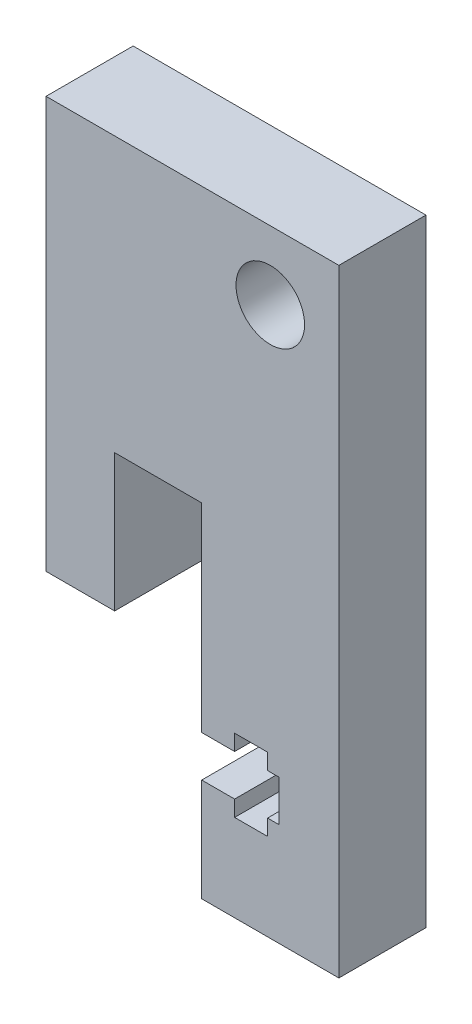
ISO-10303-21;
HEADER;
FILE_DESCRIPTION(('STEP AP214'),'2;1');
FILE_NAME('part.step','',(''),(''),'','','');
FILE_SCHEMA(('AUTOMOTIVE_DESIGN { 1 0 10303 214 1 1 1 1 }'));
ENDSEC;
DATA;
#1=APPLICATION_CONTEXT('core data for automotive mechanical design processes');
#2=APPLICATION_PROTOCOL_DEFINITION('international standard','automotive_design',2000,#1);
#3=PRODUCT_CONTEXT('',#1,'mechanical');
#4=PRODUCT('Part','Part','',(#3));
#5=PRODUCT_RELATED_PRODUCT_CATEGORY('part','',(#4));
#6=PRODUCT_DEFINITION_FORMATION('','',#4);
#7=PRODUCT_DEFINITION_CONTEXT('part definition',#1,'design');
#8=PRODUCT_DEFINITION('design','',#6,#7);
#9=PRODUCT_DEFINITION_SHAPE('','',#8);
#10=(LENGTH_UNIT() NAMED_UNIT(*) SI_UNIT(.MILLI.,.METRE.));
#11=(NAMED_UNIT(*) PLANE_ANGLE_UNIT() SI_UNIT($,.RADIAN.));
#12=(NAMED_UNIT(*) SI_UNIT($,.STERADIAN.) SOLID_ANGLE_UNIT());
#13=UNCERTAINTY_MEASURE_WITH_UNIT(LENGTH_MEASURE(1.E-05),#10,'distance_accuracy_value','');
#14=(GEOMETRIC_REPRESENTATION_CONTEXT(3) GLOBAL_UNCERTAINTY_ASSIGNED_CONTEXT((#13)) GLOBAL_UNIT_ASSIGNED_CONTEXT((#10,
#11,#12)) REPRESENTATION_CONTEXT('',''));
#15=CARTESIAN_POINT('',(0.,0.,0.));
#16=DIRECTION('',(0.,0.,1.));
#17=DIRECTION('',(1.,0.,0.));
#18=AXIS2_PLACEMENT_3D('',#15,#16,#17);
#19=CARTESIAN_POINT('',(0.940553214138691,0.,6.35));
#20=DIRECTION('',(-1.,0.,0.));
#21=DIRECTION('',(0.,-1.,0.));
#22=AXIS2_PLACEMENT_3D('',#19,#20,#21);
#23=PLANE('',#22);
#24=DIRECTION('',(0.,1.,0.));
#25=VECTOR('',#24,1.);
#26=CARTESIAN_POINT('',(0.940553214138691,0.,0.));
#27=LINE('',#26,#25);
#28=CARTESIAN_POINT('',(0.940553214138687,-4.4432697036601,0.));
#29=VERTEX_POINT('',#28);
#30=CARTESIAN_POINT('',(0.940553214138688,-3.2832697036601,0.));
#31=VERTEX_POINT('',#30);
#32=EDGE_CURVE('E213',#29,#31,#27,.T.);
#33=ORIENTED_EDGE('',*,*,#32,.T.);
#34=DIRECTION('',(0.,0.,-1.));
#35=VECTOR('',#34,1.);
#36=CARTESIAN_POINT('',(0.940553214138688,-3.2832697036601,6.35));
#37=LINE('',#36,#35);
#38=CARTESIAN_POINT('',(0.940553214138688,-3.2832697036601,6.35));
#39=VERTEX_POINT('',#38);
#40=EDGE_CURVE('E11',#39,#31,#37,.T.);
#41=ORIENTED_EDGE('',*,*,#40,.F.);
#42=DIRECTION('',(0.,1.,0.));
#43=VECTOR('',#42,1.);
#44=CARTESIAN_POINT('',(0.940553214138691,0.,6.35));
#45=LINE('',#44,#43);
#46=CARTESIAN_POINT('',(0.940553214138687,-4.4432697036601,6.35));
#47=VERTEX_POINT('',#46);
#48=EDGE_CURVE('E319',#47,#39,#45,.T.);
#49=ORIENTED_EDGE('',*,*,#48,.F.);
#50=DIRECTION('',(0.,0.,-1.));
#51=VECTOR('',#50,1.);
#52=CARTESIAN_POINT('',(0.940553214138687,-4.4432697036601,6.35));
#53=LINE('',#52,#51);
#54=EDGE_CURVE('E206',#47,#29,#53,.T.);
#55=ORIENTED_EDGE('',*,*,#54,.T.);
#56=EDGE_LOOP('',(#33,#41,#49,#55));
#57=FACE_BOUND('',#56,.T.);
#58=ADVANCED_FACE('F41',(#57),#23,.F.);
#59=CARTESIAN_POINT('',(0.,-3.2832697036601,6.35));
#60=DIRECTION('',(0.,-1.,0.));
#61=DIRECTION('',(0.,0.,-1.));
#62=AXIS2_PLACEMENT_3D('',#59,#60,#61);
#63=PLANE('',#62);
#64=DIRECTION('',(-1.,0.,0.));
#65=VECTOR('',#64,1.);
#66=CARTESIAN_POINT('',(0.,-3.2832697036601,0.));
#67=LINE('',#66,#65);
#68=CARTESIAN_POINT('',(-1.45944678586131,-3.2832697036601,0.));
#69=VERTEX_POINT('',#68);
#70=EDGE_CURVE('E216',#31,#69,#67,.T.);
#71=ORIENTED_EDGE('',*,*,#70,.T.);
#72=DIRECTION('',(0.,0.,-1.));
#73=VECTOR('',#72,1.);
#74=CARTESIAN_POINT('',(-1.45944678586131,-3.2832697036601,6.35));
#75=LINE('',#74,#73);
#76=CARTESIAN_POINT('',(-1.45944678586131,-3.2832697036601,6.35));
#77=VERTEX_POINT('',#76);
#78=EDGE_CURVE('E50',#77,#69,#75,.T.);
#79=ORIENTED_EDGE('',*,*,#78,.F.);
#80=DIRECTION('',(-1.,0.,0.));
#81=VECTOR('',#80,1.);
#82=CARTESIAN_POINT('',(0.,-3.2832697036601,6.35));
#83=LINE('',#82,#81);
#84=EDGE_CURVE('E137',#39,#77,#83,.T.);
#85=ORIENTED_EDGE('',*,*,#84,.F.);
#86=ORIENTED_EDGE('',*,*,#40,.T.);
#87=EDGE_LOOP('',(#71,#79,#85,#86));
#88=FACE_BOUND('',#87,.T.);
#89=ADVANCED_FACE('F301',(#88),#63,.F.);
#90=CARTESIAN_POINT('',(-1.45944678586131,0.,6.35));
#91=DIRECTION('',(-1.,0.,0.));
#92=DIRECTION('',(0.,0.,1.));
#93=AXIS2_PLACEMENT_3D('',#90,#91,#92);
#94=PLANE('',#93);
#95=DIRECTION('',(0.,1.,0.));
#96=VECTOR('',#95,1.);
#97=CARTESIAN_POINT('',(-1.45944678586131,0.,0.));
#98=LINE('',#97,#96);
#99=CARTESIAN_POINT('',(-1.45944678586131,-10.7832697036601,0.));
#100=VERTEX_POINT('',#99);
#101=EDGE_CURVE('E219',#100,#69,#98,.T.);
#102=ORIENTED_EDGE('',*,*,#101,.F.);
#103=DIRECTION('',(0.,0.,-1.));
#104=VECTOR('',#103,1.);
#105=CARTESIAN_POINT('',(-1.45944678586131,-10.7832697036601,6.35));
#106=LINE('',#105,#104);
#107=CARTESIAN_POINT('',(-1.45944678586131,-10.7832697036601,6.35));
#108=VERTEX_POINT('',#107);
#109=EDGE_CURVE('E294',#108,#100,#106,.T.);
#110=ORIENTED_EDGE('',*,*,#109,.F.);
#111=DIRECTION('',(0.,1.,0.));
#112=VECTOR('',#111,1.);
#113=CARTESIAN_POINT('',(-1.45944678586131,0.,6.35));
#114=LINE('',#113,#112);
#115=EDGE_CURVE('E300',#108,#77,#114,.T.);
#116=ORIENTED_EDGE('',*,*,#115,.T.);
#117=ORIENTED_EDGE('',*,*,#78,.T.);
#118=EDGE_LOOP('',(#102,#110,#116,#117));
#119=FACE_BOUND('',#118,.T.);
#120=ADVANCED_FACE('F298',(#119),#94,.T.);
#121=CARTESIAN_POINT('',(0.,-10.7832697036601,6.35));
#122=DIRECTION('',(0.,-1.,0.));
#123=DIRECTION('',(0.,0.,-1.));
#124=AXIS2_PLACEMENT_3D('',#121,#122,#123);
#125=PLANE('',#124);
#126=DIRECTION('',(-1.,0.,0.));
#127=VECTOR('',#126,1.);
#128=CARTESIAN_POINT('',(0.,-10.7832697036601,0.));
#129=LINE('',#128,#127);
#130=CARTESIAN_POINT('',(8.54055321413869,-10.7832697036601,0.));
#131=VERTEX_POINT('',#130);
#132=EDGE_CURVE('E222',#131,#100,#129,.T.);
#133=ORIENTED_EDGE('',*,*,#132,.F.);
#134=DIRECTION('',(0.,0.,-1.));
#135=VECTOR('',#134,1.);
#136=CARTESIAN_POINT('',(8.54055321413869,-10.7832697036601,6.35));
#137=LINE('',#136,#135);
#138=CARTESIAN_POINT('',(8.54055321413869,-10.7832697036601,6.35));
#139=VERTEX_POINT('',#138);
#140=EDGE_CURVE('E292',#139,#131,#137,.T.);
#141=ORIENTED_EDGE('',*,*,#140,.F.);
#142=DIRECTION('',(-1.,0.,0.));
#143=VECTOR('',#142,1.);
#144=CARTESIAN_POINT('',(0.,-10.7832697036601,6.35));
#145=LINE('',#144,#143);
#146=EDGE_CURVE('E312',#139,#108,#145,.T.);
#147=ORIENTED_EDGE('',*,*,#146,.T.);
#148=ORIENTED_EDGE('',*,*,#109,.T.);
#149=EDGE_LOOP('',(#133,#141,#147,#148));
#150=FACE_BOUND('',#149,.T.);
#151=ADVANCED_FACE('F309',(#150),#125,.T.);
#152=CARTESIAN_POINT('',(8.54055321413869,0.,6.35));
#153=DIRECTION('',(1.,0.,0.));
#154=DIRECTION('',(0.,1.,0.));
#155=AXIS2_PLACEMENT_3D('',#152,#153,#154);
#156=PLANE('',#155);
#157=DIRECTION('',(0.,-1.,0.));
#158=VECTOR('',#157,1.);
#159=CARTESIAN_POINT('',(8.54055321413869,0.,0.));
#160=LINE('',#159,#158);
#161=CARTESIAN_POINT('',(8.54055321413868,34.2167302963399,0.));
#162=VERTEX_POINT('',#161);
#163=EDGE_CURVE('E226',#162,#131,#160,.T.);
#164=ORIENTED_EDGE('',*,*,#163,.F.);
#165=DIRECTION('',(0.,0.,-1.));
#166=VECTOR('',#165,1.);
#167=CARTESIAN_POINT('',(8.54055321413868,34.2167302963399,6.35));
#168=LINE('',#167,#166);
#169=CARTESIAN_POINT('',(8.54055321413868,34.2167302963399,6.35));
#170=VERTEX_POINT('',#169);
#171=EDGE_CURVE('E290',#170,#162,#168,.T.);
#172=ORIENTED_EDGE('',*,*,#171,.F.);
#173=DIRECTION('',(0.,-1.,0.));
#174=VECTOR('',#173,1.);
#175=CARTESIAN_POINT('',(8.54055321413869,0.,6.35));
#176=LINE('',#175,#174);
#177=EDGE_CURVE('E317',#170,#139,#176,.T.);
#178=ORIENTED_EDGE('',*,*,#177,.T.);
#179=ORIENTED_EDGE('',*,*,#140,.T.);
#180=EDGE_LOOP('',(#164,#172,#178,#179));
#181=FACE_BOUND('',#180,.T.);
#182=ADVANCED_FACE('F376',(#181),#156,.T.);
#183=CARTESIAN_POINT('',(0.,34.2167302963399,6.35));
#184=DIRECTION('',(0.,1.,0.));
#185=DIRECTION('',(0.,0.,1.));
#186=AXIS2_PLACEMENT_3D('',#183,#184,#185);
#187=PLANE('',#186);
#188=DIRECTION('',(1.,0.,0.));
#189=VECTOR('',#188,1.);
#190=CARTESIAN_POINT('',(0.,34.2167302963399,0.));
#191=LINE('',#190,#189);
#192=CARTESIAN_POINT('',(-12.8094467858613,34.2167302963399,0.));
#193=VERTEX_POINT('',#192);
#194=EDGE_CURVE('E229',#193,#162,#191,.T.);
#195=ORIENTED_EDGE('',*,*,#194,.F.);
#196=DIRECTION('',(0.,0.,-1.));
#197=VECTOR('',#196,1.);
#198=CARTESIAN_POINT('',(-12.8094467858613,34.2167302963399,6.35));
#199=LINE('',#198,#197);
#200=CARTESIAN_POINT('',(-12.8094467858613,34.2167302963399,6.35));
#201=VERTEX_POINT('',#200);
#202=EDGE_CURVE('E288',#201,#193,#199,.T.);
#203=ORIENTED_EDGE('',*,*,#202,.F.);
#204=DIRECTION('',(1.,0.,0.));
#205=VECTOR('',#204,1.);
#206=CARTESIAN_POINT('',(0.,34.2167302963399,6.35));
#207=LINE('',#206,#205);
#208=EDGE_CURVE('E541',#201,#170,#207,.T.);
#209=ORIENTED_EDGE('',*,*,#208,.T.);
#210=ORIENTED_EDGE('',*,*,#171,.T.);
#211=EDGE_LOOP('',(#195,#203,#209,#210));
#212=FACE_BOUND('',#211,.T.);
#213=ADVANCED_FACE('F379',(#212),#187,.T.);
#214=CARTESIAN_POINT('',(-12.8094467858613,0.,6.35));
#215=DIRECTION('',(-1.,0.,0.));
#216=DIRECTION('',(0.,0.,1.));
#217=AXIS2_PLACEMENT_3D('',#214,#215,#216);
#218=PLANE('',#217);
#219=DIRECTION('',(0.,1.,0.));
#220=VECTOR('',#219,1.);
#221=CARTESIAN_POINT('',(-12.8094467858613,0.,0.));
#222=LINE('',#221,#220);
#223=CARTESIAN_POINT('',(-12.8094467858613,4.2167302963399,0.));
#224=VERTEX_POINT('',#223);
#225=EDGE_CURVE('E232',#224,#193,#222,.T.);
#226=ORIENTED_EDGE('',*,*,#225,.F.);
#227=DIRECTION('',(0.,0.,-1.));
#228=VECTOR('',#227,1.);
#229=CARTESIAN_POINT('',(-12.8094467858613,4.2167302963399,6.35));
#230=LINE('',#229,#228);
#231=CARTESIAN_POINT('',(-12.8094467858613,4.2167302963399,6.35));
#232=VERTEX_POINT('',#231);
#233=EDGE_CURVE('E286',#232,#224,#230,.T.);
#234=ORIENTED_EDGE('',*,*,#233,.F.);
#235=DIRECTION('',(0.,1.,0.));
#236=VECTOR('',#235,1.);
#237=CARTESIAN_POINT('',(-12.8094467858613,0.,6.35));
#238=LINE('',#237,#236);
#239=EDGE_CURVE('E543',#232,#201,#238,.T.);
#240=ORIENTED_EDGE('',*,*,#239,.T.);
#241=ORIENTED_EDGE('',*,*,#202,.T.);
#242=EDGE_LOOP('',(#226,#234,#240,#241));
#243=FACE_BOUND('',#242,.T.);
#244=ADVANCED_FACE('F383',(#243),#218,.T.);
#245=CARTESIAN_POINT('',(0.,4.21673029633989,6.35));
#246=DIRECTION('',(0.,-1.,0.));
#247=DIRECTION('',(1.,0.,0.));
#248=AXIS2_PLACEMENT_3D('',#245,#246,#247);
#249=PLANE('',#248);
#250=DIRECTION('',(-1.,0.,0.));
#251=VECTOR('',#250,1.);
#252=CARTESIAN_POINT('',(0.,4.21673029633989,0.));
#253=LINE('',#252,#251);
#254=CARTESIAN_POINT('',(-7.80944678586131,4.2167302963399,0.));
#255=VERTEX_POINT('',#254);
#256=EDGE_CURVE('E235',#255,#224,#253,.T.);
#257=ORIENTED_EDGE('',*,*,#256,.F.);
#258=DIRECTION('',(0.,0.,-1.));
#259=VECTOR('',#258,1.);
#260=CARTESIAN_POINT('',(-7.80944678586131,4.2167302963399,6.35));
#261=LINE('',#260,#259);
#262=CARTESIAN_POINT('',(-7.80944678586131,4.2167302963399,6.35));
#263=VERTEX_POINT('',#262);
#264=EDGE_CURVE('E284',#263,#255,#261,.T.);
#265=ORIENTED_EDGE('',*,*,#264,.F.);
#266=DIRECTION('',(-1.,0.,0.));
#267=VECTOR('',#266,1.);
#268=CARTESIAN_POINT('',(0.,4.21673029633989,6.35));
#269=LINE('',#268,#267);
#270=EDGE_CURVE('E334',#263,#232,#269,.T.);
#271=ORIENTED_EDGE('',*,*,#270,.T.);
#272=ORIENTED_EDGE('',*,*,#233,.T.);
#273=EDGE_LOOP('',(#257,#265,#271,#272));
#274=FACE_BOUND('',#273,.T.);
#275=ADVANCED_FACE('F387',(#274),#249,.T.);
#276=CARTESIAN_POINT('',(-7.80944678586131,0.,6.35));
#277=DIRECTION('',(1.,0.,0.));
#278=DIRECTION('',(0.,1.,0.));
#279=AXIS2_PLACEMENT_3D('',#276,#277,#278);
#280=PLANE('',#279);
#281=DIRECTION('',(0.,-1.,0.));
#282=VECTOR('',#281,1.);
#283=CARTESIAN_POINT('',(-7.80944678586131,0.,0.));
#284=LINE('',#283,#282);
#285=CARTESIAN_POINT('',(-7.80944678586131,14.2167302963399,0.));
#286=VERTEX_POINT('',#285);
#287=EDGE_CURVE('E238',#286,#255,#284,.T.);
#288=ORIENTED_EDGE('',*,*,#287,.F.);
#289=DIRECTION('',(0.,0.,-1.));
#290=VECTOR('',#289,1.);
#291=CARTESIAN_POINT('',(-7.80944678586131,14.2167302963399,6.35));
#292=LINE('',#291,#290);
#293=CARTESIAN_POINT('',(-7.80944678586131,14.2167302963399,6.35));
#294=VERTEX_POINT('',#293);
#295=EDGE_CURVE('E282',#294,#286,#292,.T.);
#296=ORIENTED_EDGE('',*,*,#295,.F.);
#297=DIRECTION('',(0.,-1.,0.));
#298=VECTOR('',#297,1.);
#299=CARTESIAN_POINT('',(-7.80944678586131,0.,6.35));
#300=LINE('',#299,#298);
#301=EDGE_CURVE('E329',#294,#263,#300,.T.);
#302=ORIENTED_EDGE('',*,*,#301,.T.);
#303=ORIENTED_EDGE('',*,*,#264,.T.);
#304=EDGE_LOOP('',(#288,#296,#302,#303));
#305=FACE_BOUND('',#304,.T.);
#306=ADVANCED_FACE('F391',(#305),#280,.T.);
#307=CARTESIAN_POINT('',(0.,14.2167302963399,6.35));
#308=DIRECTION('',(0.,-1.,0.));
#309=DIRECTION('',(0.,0.,-1.));
#310=AXIS2_PLACEMENT_3D('',#307,#308,#309);
#311=PLANE('',#310);
#312=DIRECTION('',(-1.,0.,0.));
#313=VECTOR('',#312,1.);
#314=CARTESIAN_POINT('',(0.,14.2167302963399,0.));
#315=LINE('',#314,#313);
#316=CARTESIAN_POINT('',(-1.45944678586131,14.2167302963399,0.));
#317=VERTEX_POINT('',#316);
#318=EDGE_CURVE('E241',#317,#286,#315,.T.);
#319=ORIENTED_EDGE('',*,*,#318,.F.);
#320=DIRECTION('',(0.,0.,-1.));
#321=VECTOR('',#320,1.);
#322=CARTESIAN_POINT('',(-1.45944678586131,14.2167302963399,6.35));
#323=LINE('',#322,#321);
#324=CARTESIAN_POINT('',(-1.45944678586131,14.2167302963399,6.35));
#325=VERTEX_POINT('',#324);
#326=EDGE_CURVE('E280',#325,#317,#323,.T.);
#327=ORIENTED_EDGE('',*,*,#326,.F.);
#328=DIRECTION('',(-1.,0.,0.));
#329=VECTOR('',#328,1.);
#330=CARTESIAN_POINT('',(0.,14.2167302963399,6.35));
#331=LINE('',#330,#329);
#332=EDGE_CURVE('E323',#325,#294,#331,.T.);
#333=ORIENTED_EDGE('',*,*,#332,.T.);
#334=ORIENTED_EDGE('',*,*,#295,.T.);
#335=EDGE_LOOP('',(#319,#327,#333,#334));
#336=FACE_BOUND('',#335,.T.);
#337=ADVANCED_FACE('F395',(#336),#311,.T.);
#338=CARTESIAN_POINT('',(-1.45944678586131,-0.283269703660103,0.));
#339=VERTEX_POINT('',#338);
#340=EDGE_CURVE('E223',#339,#317,#98,.T.);
#341=ORIENTED_EDGE('',*,*,#340,.F.);
#342=DIRECTION('',(0.,0.,-1.));
#343=VECTOR('',#342,1.);
#344=CARTESIAN_POINT('',(-1.45944678586131,-0.283269703660103,6.35));
#345=LINE('',#344,#343);
#346=CARTESIAN_POINT('',(-1.45944678586131,-0.283269703660103,6.35));
#347=VERTEX_POINT('',#346);
#348=EDGE_CURVE('E278',#347,#339,#345,.T.);
#349=ORIENTED_EDGE('',*,*,#348,.F.);
#350=EDGE_CURVE('E316',#347,#325,#114,.T.);
#351=ORIENTED_EDGE('',*,*,#350,.T.);
#352=ORIENTED_EDGE('',*,*,#326,.T.);
#353=EDGE_LOOP('',(#341,#349,#351,#352));
#354=FACE_BOUND('',#353,.T.);
#355=ADVANCED_FACE('F399',(#354),#94,.T.);
#356=CARTESIAN_POINT('',(0.,-0.283269703660103,6.35));
#357=DIRECTION('',(0.,1.,0.));
#358=DIRECTION('',(-1.,0.,0.));
#359=AXIS2_PLACEMENT_3D('',#356,#357,#358);
#360=PLANE('',#359);
#361=DIRECTION('',(1.,0.,0.));
#362=VECTOR('',#361,1.);
#363=CARTESIAN_POINT('',(0.,-0.283269703660103,0.));
#364=LINE('',#363,#362);
#365=CARTESIAN_POINT('',(0.940553214138687,-0.283269703660102,0.));
#366=VERTEX_POINT('',#365);
#367=EDGE_CURVE('E244',#339,#366,#364,.T.);
#368=ORIENTED_EDGE('',*,*,#367,.T.);
#369=DIRECTION('',(0.,0.,-1.));
#370=VECTOR('',#369,1.);
#371=CARTESIAN_POINT('',(0.940553214138687,-0.283269703660102,6.35));
#372=LINE('',#371,#370);
#373=CARTESIAN_POINT('',(0.940553214138687,-0.283269703660102,6.35));
#374=VERTEX_POINT('',#373);
#375=EDGE_CURVE('E275',#374,#366,#372,.T.);
#376=ORIENTED_EDGE('',*,*,#375,.F.);
#377=DIRECTION('',(1.,0.,0.));
#378=VECTOR('',#377,1.);
#379=CARTESIAN_POINT('',(0.,-0.283269703660103,6.35));
#380=LINE('',#379,#378);
#381=EDGE_CURVE('E322',#347,#374,#380,.T.);
#382=ORIENTED_EDGE('',*,*,#381,.F.);
#383=ORIENTED_EDGE('',*,*,#348,.T.);
#384=EDGE_LOOP('',(#368,#376,#382,#383));
#385=FACE_BOUND('',#384,.T.);
#386=ADVANCED_FACE('F402',(#385),#360,.F.);
#387=CARTESIAN_POINT('',(0.940553214138687,0.,6.35));
#388=DIRECTION('',(-1.,0.,0.));
#389=DIRECTION('',(0.,0.,1.));
#390=AXIS2_PLACEMENT_3D('',#387,#388,#389);
#391=PLANE('',#390);
#392=DIRECTION('',(0.,1.,0.));
#393=VECTOR('',#392,1.);
#394=CARTESIAN_POINT('',(0.940553214138687,0.,0.));
#395=LINE('',#394,#393);
#396=CARTESIAN_POINT('',(0.940553214138687,0.876730296339899,0.));
#397=VERTEX_POINT('',#396);
#398=EDGE_CURVE('E246',#366,#397,#395,.T.);
#399=ORIENTED_EDGE('',*,*,#398,.T.);
#400=DIRECTION('',(0.,0.,-1.));
#401=VECTOR('',#400,1.);
#402=CARTESIAN_POINT('',(0.940553214138687,0.876730296339899,6.35));
#403=LINE('',#402,#401);
#404=CARTESIAN_POINT('',(0.940553214138687,0.876730296339899,6.35));
#405=VERTEX_POINT('',#404);
#406=EDGE_CURVE('E272',#405,#397,#403,.T.);
#407=ORIENTED_EDGE('',*,*,#406,.F.);
#408=DIRECTION('',(0.,1.,0.));
#409=VECTOR('',#408,1.);
#410=CARTESIAN_POINT('',(0.940553214138687,0.,6.35));
#411=LINE('',#410,#409);
#412=EDGE_CURVE('E326',#374,#405,#411,.T.);
#413=ORIENTED_EDGE('',*,*,#412,.F.);
#414=ORIENTED_EDGE('',*,*,#375,.T.);
#415=EDGE_LOOP('',(#399,#407,#413,#414));
#416=FACE_BOUND('',#415,.T.);
#417=ADVANCED_FACE('F405',(#416),#391,.F.);
#418=CARTESIAN_POINT('',(0.,0.876730296339899,6.35));
#419=DIRECTION('',(0.,1.,0.));
#420=DIRECTION('',(0.,0.,1.));
#421=AXIS2_PLACEMENT_3D('',#418,#419,#420);
#422=PLANE('',#421);
#423=DIRECTION('',(1.,0.,0.));
#424=VECTOR('',#423,1.);
#425=CARTESIAN_POINT('',(0.,0.876730296339899,0.));
#426=LINE('',#425,#424);
#427=CARTESIAN_POINT('',(3.34055321413869,0.876730296339899,0.));
#428=VERTEX_POINT('',#427);
#429=EDGE_CURVE('E248',#397,#428,#426,.T.);
#430=ORIENTED_EDGE('',*,*,#429,.T.);
#431=DIRECTION('',(0.,0.,-1.));
#432=VECTOR('',#431,1.);
#433=CARTESIAN_POINT('',(3.34055321413869,0.876730296339899,6.35));
#434=LINE('',#433,#432);
#435=CARTESIAN_POINT('',(3.34055321413869,0.876730296339899,6.35));
#436=VERTEX_POINT('',#435);
#437=EDGE_CURVE('E269',#436,#428,#434,.T.);
#438=ORIENTED_EDGE('',*,*,#437,.F.);
#439=DIRECTION('',(1.,0.,0.));
#440=VECTOR('',#439,1.);
#441=CARTESIAN_POINT('',(0.,0.876730296339899,6.35));
#442=LINE('',#441,#440);
#443=EDGE_CURVE('E339',#405,#436,#442,.T.);
#444=ORIENTED_EDGE('',*,*,#443,.F.);
#445=ORIENTED_EDGE('',*,*,#406,.T.);
#446=EDGE_LOOP('',(#430,#438,#444,#445));
#447=FACE_BOUND('',#446,.T.);
#448=ADVANCED_FACE('F409',(#447),#422,.F.);
#449=CARTESIAN_POINT('',(3.34055321413868,0.,6.35));
#450=DIRECTION('',(1.,0.,0.));
#451=DIRECTION('',(0.,1.,0.));
#452=AXIS2_PLACEMENT_3D('',#449,#450,#451);
#453=PLANE('',#452);
#454=DIRECTION('',(0.,-1.,0.));
#455=VECTOR('',#454,1.);
#456=CARTESIAN_POINT('',(3.34055321413868,0.,0.));
#457=LINE('',#456,#455);
#458=CARTESIAN_POINT('',(3.34055321413868,-0.2832697036601,0.));
#459=VERTEX_POINT('',#458);
#460=EDGE_CURVE('E250',#428,#459,#457,.T.);
#461=ORIENTED_EDGE('',*,*,#460,.T.);
#462=DIRECTION('',(0.,0.,-1.));
#463=VECTOR('',#462,1.);
#464=CARTESIAN_POINT('',(3.34055321413868,-0.2832697036601,6.35));
#465=LINE('',#464,#463);
#466=CARTESIAN_POINT('',(3.34055321413868,-0.2832697036601,6.35));
#467=VERTEX_POINT('',#466);
#468=EDGE_CURVE('E266',#467,#459,#465,.T.);
#469=ORIENTED_EDGE('',*,*,#468,.F.);
#470=DIRECTION('',(0.,-1.,0.));
#471=VECTOR('',#470,1.);
#472=CARTESIAN_POINT('',(3.34055321413868,0.,6.35));
#473=LINE('',#472,#471);
#474=EDGE_CURVE('E341',#436,#467,#473,.T.);
#475=ORIENTED_EDGE('',*,*,#474,.F.);
#476=ORIENTED_EDGE('',*,*,#437,.T.);
#477=EDGE_LOOP('',(#461,#469,#475,#476));
#478=FACE_BOUND('',#477,.T.);
#479=ADVANCED_FACE('F413',(#478),#453,.F.);
#480=CARTESIAN_POINT('',(0.,-0.283269703660095,6.35));
#481=DIRECTION('',(0.,1.,0.));
#482=DIRECTION('',(-1.,0.,0.));
#483=AXIS2_PLACEMENT_3D('',#480,#481,#482);
#484=PLANE('',#483);
#485=DIRECTION('',(1.,0.,0.));
#486=VECTOR('',#485,1.);
#487=CARTESIAN_POINT('',(0.,-0.283269703660095,0.));
#488=LINE('',#487,#486);
#489=CARTESIAN_POINT('',(4.19055321413868,-0.283269703660102,0.));
#490=VERTEX_POINT('',#489);
#491=EDGE_CURVE('E252',#459,#490,#488,.T.);
#492=ORIENTED_EDGE('',*,*,#491,.T.);
#493=DIRECTION('',(0.,0.,-1.));
#494=VECTOR('',#493,1.);
#495=CARTESIAN_POINT('',(4.19055321413868,-0.283269703660102,6.35));
#496=LINE('',#495,#494);
#497=CARTESIAN_POINT('',(4.19055321413868,-0.283269703660102,6.35));
#498=VERTEX_POINT('',#497);
#499=EDGE_CURVE('E263',#498,#490,#496,.T.);
#500=ORIENTED_EDGE('',*,*,#499,.F.);
#501=DIRECTION('',(1.,0.,0.));
#502=VECTOR('',#501,1.);
#503=CARTESIAN_POINT('',(0.,-0.283269703660095,6.35));
#504=LINE('',#503,#502);
#505=EDGE_CURVE('E343',#467,#498,#504,.T.);
#506=ORIENTED_EDGE('',*,*,#505,.F.);
#507=ORIENTED_EDGE('',*,*,#468,.T.);
#508=EDGE_LOOP('',(#492,#500,#506,#507));
#509=FACE_BOUND('',#508,.T.);
#510=ADVANCED_FACE('F349',(#509),#484,.F.);
#511=CARTESIAN_POINT('',(4.19055321413868,0.,6.35));
#512=DIRECTION('',(1.,0.,0.));
#513=DIRECTION('',(0.,1.,0.));
#514=AXIS2_PLACEMENT_3D('',#511,#512,#513);
#515=PLANE('',#514);
#516=DIRECTION('',(0.,-1.,0.));
#517=VECTOR('',#516,1.);
#518=CARTESIAN_POINT('',(4.19055321413868,0.,0.));
#519=LINE('',#518,#517);
#520=CARTESIAN_POINT('',(4.19055321413868,-3.2832697036601,0.));
#521=VERTEX_POINT('',#520);
#522=EDGE_CURVE('E254',#490,#521,#519,.T.);
#523=ORIENTED_EDGE('',*,*,#522,.T.);
#524=DIRECTION('',(0.,0.,-1.));
#525=VECTOR('',#524,1.);
#526=CARTESIAN_POINT('',(4.19055321413868,-3.2832697036601,6.35));
#527=LINE('',#526,#525);
#528=CARTESIAN_POINT('',(4.19055321413868,-3.2832697036601,6.35));
#529=VERTEX_POINT('',#528);
#530=EDGE_CURVE('E201',#529,#521,#527,.T.);
#531=ORIENTED_EDGE('',*,*,#530,.F.);
#532=DIRECTION('',(0.,-1.,0.));
#533=VECTOR('',#532,1.);
#534=CARTESIAN_POINT('',(4.19055321413868,0.,6.35));
#535=LINE('',#534,#533);
#536=EDGE_CURVE('E192',#498,#529,#535,.T.);
#537=ORIENTED_EDGE('',*,*,#536,.F.);
#538=ORIENTED_EDGE('',*,*,#499,.T.);
#539=EDGE_LOOP('',(#523,#531,#537,#538));
#540=FACE_BOUND('',#539,.T.);
#541=ADVANCED_FACE('F353',(#540),#515,.F.);
#542=CARTESIAN_POINT('',(0.,-3.2832697036601,6.35));
#543=DIRECTION('',(0.,-1.,0.));
#544=DIRECTION('',(0.,0.,-1.));
#545=AXIS2_PLACEMENT_3D('',#542,#543,#544);
#546=PLANE('',#545);
#547=DIRECTION('',(-1.,0.,0.));
#548=VECTOR('',#547,1.);
#549=CARTESIAN_POINT('',(0.,-3.2832697036601,0.));
#550=LINE('',#549,#548);
#551=CARTESIAN_POINT('',(3.34055321413869,-3.2832697036601,0.));
#552=VERTEX_POINT('',#551);
#553=EDGE_CURVE('E200',#521,#552,#550,.T.);
#554=ORIENTED_EDGE('',*,*,#553,.T.);
#555=DIRECTION('',(0.,0.,-1.));
#556=VECTOR('',#555,1.);
#557=CARTESIAN_POINT('',(3.34055321413869,-3.2832697036601,6.35));
#558=LINE('',#557,#556);
#559=CARTESIAN_POINT('',(3.34055321413869,-3.2832697036601,6.35));
#560=VERTEX_POINT('',#559);
#561=EDGE_CURVE('E197',#560,#552,#558,.T.);
#562=ORIENTED_EDGE('',*,*,#561,.F.);
#563=DIRECTION('',(-1.,0.,0.));
#564=VECTOR('',#563,1.);
#565=CARTESIAN_POINT('',(0.,-3.2832697036601,6.35));
#566=LINE('',#565,#564);
#567=EDGE_CURVE('E186',#529,#560,#566,.T.);
#568=ORIENTED_EDGE('',*,*,#567,.F.);
#569=ORIENTED_EDGE('',*,*,#530,.T.);
#570=EDGE_LOOP('',(#554,#562,#568,#569));
#571=FACE_BOUND('',#570,.T.);
#572=ADVANCED_FACE('F198',(#571),#546,.F.);
#573=CARTESIAN_POINT('',(3.34055321413868,0.,6.35));
#574=DIRECTION('',(1.,0.,0.));
#575=DIRECTION('',(0.,1.,0.));
#576=AXIS2_PLACEMENT_3D('',#573,#574,#575);
#577=PLANE('',#576);
#578=DIRECTION('',(0.,-1.,0.));
#579=VECTOR('',#578,1.);
#580=CARTESIAN_POINT('',(3.34055321413868,0.,0.));
#581=LINE('',#580,#579);
#582=CARTESIAN_POINT('',(3.34055321413869,-4.4432697036601,0.));
#583=VERTEX_POINT('',#582);
#584=EDGE_CURVE('E123',#552,#583,#581,.T.);
#585=ORIENTED_EDGE('',*,*,#584,.T.);
#586=DIRECTION('',(0.,0.,-1.));
#587=VECTOR('',#586,1.);
#588=CARTESIAN_POINT('',(3.34055321413869,-4.4432697036601,6.35));
#589=LINE('',#588,#587);
#590=CARTESIAN_POINT('',(3.34055321413869,-4.4432697036601,6.35));
#591=VERTEX_POINT('',#590);
#592=EDGE_CURVE('E202',#591,#583,#589,.T.);
#593=ORIENTED_EDGE('',*,*,#592,.F.);
#594=DIRECTION('',(0.,-1.,0.));
#595=VECTOR('',#594,1.);
#596=CARTESIAN_POINT('',(3.34055321413868,0.,6.35));
#597=LINE('',#596,#595);
#598=EDGE_CURVE('E190',#560,#591,#597,.T.);
#599=ORIENTED_EDGE('',*,*,#598,.F.);
#600=ORIENTED_EDGE('',*,*,#561,.T.);
#601=EDGE_LOOP('',(#585,#593,#599,#600));
#602=FACE_BOUND('',#601,.T.);
#603=ADVANCED_FACE('F204',(#602),#577,.F.);
#604=CARTESIAN_POINT('',(3.54055321413869,29.2167302963399,6.35));
#605=DIRECTION('',(0.,0.,-1.));
#606=DIRECTION('',(-1.,0.,0.));
#607=AXIS2_PLACEMENT_3D('',#604,#605,#606);
#608=CYLINDRICAL_SURFACE('',#607,2.5);
#609=CARTESIAN_POINT('',(3.54055321413869,29.2167302963399,6.35));
#610=DIRECTION('',(0.,0.,1.));
#611=DIRECTION('',(1.,0.,0.));
#612=AXIS2_PLACEMENT_3D('',#609,#610,#611);
#613=CIRCLE('',#612,2.5);
#614=CARTESIAN_POINT('',(6.04055321413869,29.2167302963399,6.35));
#615=VERTEX_POINT('',#614);
#616=EDGE_CURVE('E259',#615,#615,#613,.T.);
#617=ORIENTED_EDGE('',*,*,#616,.T.);
#618=EDGE_LOOP('',(#617));
#619=FACE_BOUND('',#618,.T.);
#620=CARTESIAN_POINT('',(3.54055321413869,29.2167302963399,0.));
#621=DIRECTION('',(0.,0.,1.));
#622=DIRECTION('',(1.,0.,0.));
#623=AXIS2_PLACEMENT_3D('',#620,#621,#622);
#624=CIRCLE('',#623,2.5);
#625=CARTESIAN_POINT('',(6.04055321413869,29.2167302963399,0.));
#626=VERTEX_POINT('',#625);
#627=EDGE_CURVE('E210',#626,#626,#624,.T.);
#628=ORIENTED_EDGE('',*,*,#627,.F.);
#629=EDGE_LOOP('',(#628));
#630=FACE_BOUND('',#629,.T.);
#631=ADVANCED_FACE('F43',(#619,#630),#608,.F.);
#632=CARTESIAN_POINT('',(0.,-4.4432697036601,6.35));
#633=DIRECTION('',(0.,-1.,0.));
#634=DIRECTION('',(0.,0.,-1.));
#635=AXIS2_PLACEMENT_3D('',#632,#633,#634);
#636=PLANE('',#635);
#637=DIRECTION('',(-1.,0.,0.));
#638=VECTOR('',#637,1.);
#639=CARTESIAN_POINT('',(0.,-4.4432697036601,0.));
#640=LINE('',#639,#638);
#641=EDGE_CURVE('E129',#583,#29,#640,.T.);
#642=ORIENTED_EDGE('',*,*,#641,.T.);
#643=ORIENTED_EDGE('',*,*,#54,.F.);
#644=DIRECTION('',(-1.,0.,0.));
#645=VECTOR('',#644,1.);
#646=CARTESIAN_POINT('',(0.,-4.4432697036601,6.35));
#647=LINE('',#646,#645);
#648=EDGE_CURVE('E58',#591,#47,#647,.T.);
#649=ORIENTED_EDGE('',*,*,#648,.F.);
#650=ORIENTED_EDGE('',*,*,#592,.T.);
#651=EDGE_LOOP('',(#642,#643,#649,#650));
#652=FACE_BOUND('',#651,.T.);
#653=ADVANCED_FACE('F356',(#652),#636,.F.);
#654=CARTESIAN_POINT('',(0.,0.,6.35));
#655=DIRECTION('',(0.,0.,1.));
#656=DIRECTION('',(1.,0.,0.));
#657=AXIS2_PLACEMENT_3D('',#654,#655,#656);
#658=PLANE('',#657);
#659=ORIENTED_EDGE('',*,*,#616,.F.);
#660=EDGE_LOOP('',(#659));
#661=FACE_BOUND('',#660,.T.);
#662=ORIENTED_EDGE('',*,*,#48,.T.);
#663=ORIENTED_EDGE('',*,*,#84,.T.);
#664=ORIENTED_EDGE('',*,*,#115,.F.);
#665=ORIENTED_EDGE('',*,*,#146,.F.);
#666=ORIENTED_EDGE('',*,*,#177,.F.);
#667=ORIENTED_EDGE('',*,*,#208,.F.);
#668=ORIENTED_EDGE('',*,*,#239,.F.);
#669=ORIENTED_EDGE('',*,*,#270,.F.);
#670=ORIENTED_EDGE('',*,*,#301,.F.);
#671=ORIENTED_EDGE('',*,*,#332,.F.);
#672=ORIENTED_EDGE('',*,*,#350,.F.);
#673=ORIENTED_EDGE('',*,*,#381,.T.);
#674=ORIENTED_EDGE('',*,*,#412,.T.);
#675=ORIENTED_EDGE('',*,*,#443,.T.);
#676=ORIENTED_EDGE('',*,*,#474,.T.);
#677=ORIENTED_EDGE('',*,*,#505,.T.);
#678=ORIENTED_EDGE('',*,*,#536,.T.);
#679=ORIENTED_EDGE('',*,*,#567,.T.);
#680=ORIENTED_EDGE('',*,*,#598,.T.);
#681=ORIENTED_EDGE('',*,*,#648,.T.);
#682=EDGE_LOOP('',(#662,#663,#664,#665,#666,#667,#668,#669,#670,#671,#672,#673,#674,#675,#676,
#677,#678,#679,#680,#681));
#683=FACE_BOUND('',#682,.T.);
#684=ADVANCED_FACE('F188',(#661,#683),#658,.T.);
#685=CARTESIAN_POINT('',(0.,0.,0.));
#686=DIRECTION('',(0.,0.,1.));
#687=DIRECTION('',(1.,0.,0.));
#688=AXIS2_PLACEMENT_3D('',#685,#686,#687);
#689=PLANE('',#688);
#690=ORIENTED_EDGE('',*,*,#627,.T.);
#691=EDGE_LOOP('',(#690));
#692=FACE_BOUND('',#691,.T.);
#693=ORIENTED_EDGE('',*,*,#32,.F.);
#694=ORIENTED_EDGE('',*,*,#641,.F.);
#695=ORIENTED_EDGE('',*,*,#584,.F.);
#696=ORIENTED_EDGE('',*,*,#553,.F.);
#697=ORIENTED_EDGE('',*,*,#522,.F.);
#698=ORIENTED_EDGE('',*,*,#491,.F.);
#699=ORIENTED_EDGE('',*,*,#460,.F.);
#700=ORIENTED_EDGE('',*,*,#429,.F.);
#701=ORIENTED_EDGE('',*,*,#398,.F.);
#702=ORIENTED_EDGE('',*,*,#367,.F.);
#703=ORIENTED_EDGE('',*,*,#340,.T.);
#704=ORIENTED_EDGE('',*,*,#318,.T.);
#705=ORIENTED_EDGE('',*,*,#287,.T.);
#706=ORIENTED_EDGE('',*,*,#256,.T.);
#707=ORIENTED_EDGE('',*,*,#225,.T.);
#708=ORIENTED_EDGE('',*,*,#194,.T.);
#709=ORIENTED_EDGE('',*,*,#163,.T.);
#710=ORIENTED_EDGE('',*,*,#132,.T.);
#711=ORIENTED_EDGE('',*,*,#101,.T.);
#712=ORIENTED_EDGE('',*,*,#70,.F.);
#713=EDGE_LOOP('',(#693,#694,#695,#696,#697,#698,#699,#700,#701,#702,#703,#704,#705,#706,#707,
#708,#709,#710,#711,#712));
#714=FACE_BOUND('',#713,.T.);
#715=ADVANCED_FACE('F305',(#692,#714),#689,.F.);
#716=CLOSED_SHELL('',(#58,#89,#120,#151,#182,#213,#244,#275,#306,#337,#355,#386,#417,#448,#479,
#510,#541,#572,#603,#631,#653,#684,#715));
#717=MANIFOLD_SOLID_BREP('B2',#716);
#718=ADVANCED_BREP_SHAPE_REPRESENTATION('',(#18,#717),#14);
#719=SHAPE_DEFINITION_REPRESENTATION(#9,#718);
ENDSEC;
END-ISO-10303-21;
